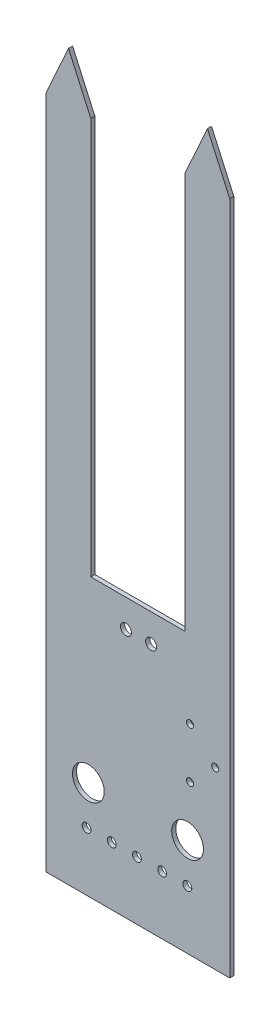
ISO-10303-21;
HEADER;
FILE_DESCRIPTION(('STEP AP214'),'2;1');
FILE_NAME('part.step','',(''),(''),'','','');
FILE_SCHEMA(('AUTOMOTIVE_DESIGN { 1 0 10303 214 1 1 1 1 }'));
ENDSEC;
DATA;
#1=APPLICATION_CONTEXT('core data for automotive mechanical design processes');
#2=APPLICATION_PROTOCOL_DEFINITION('international standard','automotive_design',2000,#1);
#3=PRODUCT_CONTEXT('',#1,'mechanical');
#4=PRODUCT('Part','Part','',(#3));
#5=PRODUCT_RELATED_PRODUCT_CATEGORY('part','',(#4));
#6=PRODUCT_DEFINITION_FORMATION('','',#4);
#7=PRODUCT_DEFINITION_CONTEXT('part definition',#1,'design');
#8=PRODUCT_DEFINITION('design','',#6,#7);
#9=PRODUCT_DEFINITION_SHAPE('','',#8);
#10=(LENGTH_UNIT() NAMED_UNIT(*) SI_UNIT(.MILLI.,.METRE.));
#11=(NAMED_UNIT(*) PLANE_ANGLE_UNIT() SI_UNIT($,.RADIAN.));
#12=(NAMED_UNIT(*) SI_UNIT($,.STERADIAN.) SOLID_ANGLE_UNIT());
#13=UNCERTAINTY_MEASURE_WITH_UNIT(LENGTH_MEASURE(1.E-05),#10,'distance_accuracy_value','');
#14=(GEOMETRIC_REPRESENTATION_CONTEXT(3) GLOBAL_UNCERTAINTY_ASSIGNED_CONTEXT((#13)) GLOBAL_UNIT_ASSIGNED_CONTEXT((#10,
#11,#12)) REPRESENTATION_CONTEXT('',''));
#15=CARTESIAN_POINT('',(0.,0.,0.));
#16=DIRECTION('',(0.,0.,1.));
#17=DIRECTION('',(1.,0.,0.));
#18=AXIS2_PLACEMENT_3D('',#15,#16,#17);
#19=CARTESIAN_POINT('',(149.56100463867,32.004001617432,0.41148));
#20=DIRECTION('',(0.,0.,1.));
#21=DIRECTION('',(1.,0.,0.));
#22=AXIS2_PLACEMENT_3D('',#19,#20,#21);
#23=PLANE('',#22);
#24=CARTESIAN_POINT('',(164.05999954,52.17999978,0.41148));
#25=DIRECTION('',(0.,0.,1.));
#26=DIRECTION('',(1.,0.,0.));
#27=AXIS2_PLACEMENT_3D('',#24,#25,#26);
#28=CIRCLE('',#27,0.35699954);
#29=CARTESIAN_POINT('',(164.41699908,52.17999978,0.41148));
#30=VERTEX_POINT('',#29);
#31=EDGE_CURVE('E27',#30,#30,#28,.T.);
#32=ORIENTED_EDGE('',*,*,#31,.F.);
#33=EDGE_LOOP('',(#32));
#34=FACE_BOUND('',#33,.T.);
#35=CARTESIAN_POINT('',(166.59999954,49.63999978,0.41148));
#36=DIRECTION('',(0.,0.,1.));
#37=DIRECTION('',(1.,0.,0.));
#38=AXIS2_PLACEMENT_3D('',#35,#36,#37);
#39=CIRCLE('',#38,0.35699954);
#40=CARTESIAN_POINT('',(166.95699908,49.63999978,0.41148));
#41=VERTEX_POINT('',#40);
#42=EDGE_CURVE('E232',#41,#41,#39,.T.);
#43=ORIENTED_EDGE('',*,*,#42,.F.);
#44=EDGE_LOOP('',(#43));
#45=FACE_BOUND('',#44,.T.);
#46=CARTESIAN_POINT('',(164.05999954,47.09999978,0.41148));
#47=DIRECTION('',(0.,0.,1.));
#48=DIRECTION('',(1.,0.,0.));
#49=AXIS2_PLACEMENT_3D('',#46,#47,#48);
#50=CIRCLE('',#49,0.35699954);
#51=CARTESIAN_POINT('',(164.41699908,47.09999978,0.41148));
#52=VERTEX_POINT('',#51);
#53=EDGE_CURVE('E20',#52,#52,#50,.T.);
#54=ORIENTED_EDGE('',*,*,#53,.F.);
#55=EDGE_LOOP('',(#54));
#56=FACE_BOUND('',#55,.T.);
#57=CARTESIAN_POINT('',(163.8110008,41.91860044,0.41148));
#58=DIRECTION('',(0.,0.,1.));
#59=DIRECTION('',(1.,0.,0.));
#60=AXIS2_PLACEMENT_3D('',#57,#58,#59);
#61=CIRCLE('',#60,1.59999934);
#62=CARTESIAN_POINT('',(165.41100014,41.91860044,0.41148));
#63=VERTEX_POINT('',#62);
#64=EDGE_CURVE('E389',#63,#63,#61,.T.);
#65=ORIENTED_EDGE('',*,*,#64,.F.);
#66=EDGE_LOOP('',(#65));
#67=FACE_BOUND('',#66,.T.);
#68=CARTESIAN_POINT('',(163.79000008,37.9000004,0.41148));
#69=DIRECTION('',(0.,0.,1.));
#70=DIRECTION('',(1.,0.,0.));
#71=AXIS2_PLACEMENT_3D('',#68,#69,#70);
#72=CIRCLE('',#71,0.4445);
#73=CARTESIAN_POINT('',(164.23450008,37.9000004,0.41148));
#74=VERTEX_POINT('',#73);
#75=EDGE_CURVE('E281',#74,#74,#72,.T.);
#76=ORIENTED_EDGE('',*,*,#75,.F.);
#77=EDGE_LOOP('',(#76));
#78=FACE_BOUND('',#77,.T.);
#79=CARTESIAN_POINT('',(161.25000008,37.9000004,0.41148));
#80=DIRECTION('',(0.,0.,1.));
#81=DIRECTION('',(1.,0.,0.));
#82=AXIS2_PLACEMENT_3D('',#79,#80,#81);
#83=CIRCLE('',#82,0.4445);
#84=CARTESIAN_POINT('',(161.69450008,37.9000004,0.41148));
#85=VERTEX_POINT('',#84);
#86=EDGE_CURVE('E383',#85,#85,#83,.T.);
#87=ORIENTED_EDGE('',*,*,#86,.F.);
#88=EDGE_LOOP('',(#87));
#89=FACE_BOUND('',#88,.T.);
#90=CARTESIAN_POINT('',(157.59999976,57.17999994,0.41148));
#91=DIRECTION('',(0.,0.,1.));
#92=DIRECTION('',(1.,0.,0.));
#93=AXIS2_PLACEMENT_3D('',#90,#91,#92);
#94=CIRCLE('',#93,0.5499989);
#95=CARTESIAN_POINT('',(158.14999866,57.17999994,0.41148));
#96=VERTEX_POINT('',#95);
#97=EDGE_CURVE('E294',#96,#96,#94,.T.);
#98=ORIENTED_EDGE('',*,*,#97,.F.);
#99=EDGE_LOOP('',(#98));
#100=FACE_BOUND('',#99,.T.);
#101=CARTESIAN_POINT('',(160.13999976,57.17999994,0.41148));
#102=DIRECTION('',(0.,0.,1.));
#103=DIRECTION('',(1.,0.,0.));
#104=AXIS2_PLACEMENT_3D('',#101,#102,#103);
#105=CIRCLE('',#104,0.5499989);
#106=CARTESIAN_POINT('',(160.68999866,57.17999994,0.41148));
#107=VERTEX_POINT('',#106);
#108=EDGE_CURVE('E267',#107,#107,#105,.T.);
#109=ORIENTED_EDGE('',*,*,#108,.F.);
#110=EDGE_LOOP('',(#109));
#111=FACE_BOUND('',#110,.T.);
#112=CARTESIAN_POINT('',(153.81100048,41.91860044,0.41148));
#113=DIRECTION('',(0.,0.,1.));
#114=DIRECTION('',(1.,0.,0.));
#115=AXIS2_PLACEMENT_3D('',#112,#113,#114);
#116=CIRCLE('',#115,1.59999934);
#117=CARTESIAN_POINT('',(155.41099982,41.91860044,0.41148));
#118=VERTEX_POINT('',#117);
#119=EDGE_CURVE('E290',#118,#118,#116,.T.);
#120=ORIENTED_EDGE('',*,*,#119,.F.);
#121=EDGE_LOOP('',(#120));
#122=FACE_BOUND('',#121,.T.);
#123=CARTESIAN_POINT('',(156.17000008,37.9000004,0.41148));
#124=DIRECTION('',(0.,0.,1.));
#125=DIRECTION('',(1.,0.,0.));
#126=AXIS2_PLACEMENT_3D('',#123,#124,#125);
#127=CIRCLE('',#126,0.4445);
#128=CARTESIAN_POINT('',(156.61450008,37.9000004,0.41148));
#129=VERTEX_POINT('',#128);
#130=EDGE_CURVE('E263',#129,#129,#127,.T.);
#131=ORIENTED_EDGE('',*,*,#130,.F.);
#132=EDGE_LOOP('',(#131));
#133=FACE_BOUND('',#132,.T.);
#134=CARTESIAN_POINT('',(158.71000008,37.9000004,0.41148));
#135=DIRECTION('',(0.,0.,1.));
#136=DIRECTION('',(1.,0.,0.));
#137=AXIS2_PLACEMENT_3D('',#134,#135,#136);
#138=CIRCLE('',#137,0.4445);
#139=CARTESIAN_POINT('',(159.15450008,37.9000004,0.41148));
#140=VERTEX_POINT('',#139);
#141=EDGE_CURVE('E256',#140,#140,#138,.T.);
#142=ORIENTED_EDGE('',*,*,#141,.F.);
#143=EDGE_LOOP('',(#142));
#144=FACE_BOUND('',#143,.T.);
#145=CARTESIAN_POINT('',(153.63000008,37.9000004,0.41148));
#146=DIRECTION('',(0.,0.,1.));
#147=DIRECTION('',(1.,0.,0.));
#148=AXIS2_PLACEMENT_3D('',#145,#146,#147);
#149=CIRCLE('',#148,0.4445);
#150=CARTESIAN_POINT('',(154.07450008,37.9000004,0.41148));
#151=VERTEX_POINT('',#150);
#152=EDGE_CURVE('E334',#151,#151,#149,.T.);
#153=ORIENTED_EDGE('',*,*,#152,.F.);
#154=EDGE_LOOP('',(#153));
#155=FACE_BOUND('',#154,.T.);
#156=DIRECTION('',(-1.,0.,0.));
#157=VECTOR('',#156,1.);
#158=CARTESIAN_POINT('',(168.06100463867,32.004001617432,0.41148));
#159=LINE('',#158,#157);
#160=CARTESIAN_POINT('',(168.06100463867,32.004001617432,0.41148));
#161=VERTEX_POINT('',#160);
#162=CARTESIAN_POINT('',(149.56100463867,32.004001617432,0.41148));
#163=VERTEX_POINT('',#162);
#164=EDGE_CURVE('E65',#161,#163,#159,.T.);
#165=ORIENTED_EDGE('',*,*,#164,.F.);
#166=DIRECTION('',(0.,-1.,0.));
#167=VECTOR('',#166,1.);
#168=CARTESIAN_POINT('',(168.06100463867,100.00399780273,0.41148));
#169=LINE('',#168,#167);
#170=CARTESIAN_POINT('',(168.06100463867,100.00399780273,0.41148));
#171=VERTEX_POINT('',#170);
#172=EDGE_CURVE('E356',#171,#161,#169,.T.);
#173=ORIENTED_EDGE('',*,*,#172,.F.);
#174=DIRECTION('',(0.410364677329006,-0.911921505175013,0.));
#175=VECTOR('',#174,1.);
#176=CARTESIAN_POINT('',(165.81100463867,105.00399780273,0.41148));
#177=LINE('',#176,#175);
#178=CARTESIAN_POINT('',(165.81100463867,105.00399780273,0.41148));
#179=VERTEX_POINT('',#178);
#180=EDGE_CURVE('E373',#179,#171,#177,.T.);
#181=ORIENTED_EDGE('',*,*,#180,.F.);
#182=DIRECTION('',(0.410364677329006,0.911921505175013,0.));
#183=VECTOR('',#182,1.);
#184=CARTESIAN_POINT('',(163.56100463867,100.00399780273,0.41148));
#185=LINE('',#184,#183);
#186=CARTESIAN_POINT('',(163.56100463867,100.00399780273,0.41148));
#187=VERTEX_POINT('',#186);
#188=EDGE_CURVE('E321',#187,#179,#185,.T.);
#189=ORIENTED_EDGE('',*,*,#188,.F.);
#190=DIRECTION('',(0.,1.,0.));
#191=VECTOR('',#190,1.);
#192=CARTESIAN_POINT('',(163.56100463867,60.004001617432,0.41148));
#193=LINE('',#192,#191);
#194=CARTESIAN_POINT('',(163.56100463867,60.004001617432,0.41148));
#195=VERTEX_POINT('',#194);
#196=EDGE_CURVE('E191',#195,#187,#193,.T.);
#197=ORIENTED_EDGE('',*,*,#196,.F.);
#198=DIRECTION('',(1.,0.,0.));
#199=VECTOR('',#198,1.);
#200=CARTESIAN_POINT('',(154.06100463867,60.004001617432,0.41148));
#201=LINE('',#200,#199);
#202=CARTESIAN_POINT('',(154.06100463867,60.004001617432,0.41148));
#203=VERTEX_POINT('',#202);
#204=EDGE_CURVE('E276',#203,#195,#201,.T.);
#205=ORIENTED_EDGE('',*,*,#204,.F.);
#206=DIRECTION('',(0.,-1.,0.));
#207=VECTOR('',#206,1.);
#208=CARTESIAN_POINT('',(154.06100463867,100.00399780273,0.41148));
#209=LINE('',#208,#207);
#210=CARTESIAN_POINT('',(154.06100463867,100.00399780273,0.41148));
#211=VERTEX_POINT('',#210);
#212=EDGE_CURVE('E257',#211,#203,#209,.T.);
#213=ORIENTED_EDGE('',*,*,#212,.F.);
#214=DIRECTION('',(0.410364677329006,-0.911921505175013,0.));
#215=VECTOR('',#214,1.);
#216=CARTESIAN_POINT('',(151.81100463867,105.00399780273,0.41148));
#217=LINE('',#216,#215);
#218=CARTESIAN_POINT('',(151.81100463867,105.00399780273,0.41148));
#219=VERTEX_POINT('',#218);
#220=EDGE_CURVE('E305',#219,#211,#217,.T.);
#221=ORIENTED_EDGE('',*,*,#220,.F.);
#222=DIRECTION('',(0.410364677329006,0.911921505175013,0.));
#223=VECTOR('',#222,1.);
#224=CARTESIAN_POINT('',(149.56100463867,100.00399780273,0.41148));
#225=LINE('',#224,#223);
#226=CARTESIAN_POINT('',(149.56100463867,100.00399780273,0.41148));
#227=VERTEX_POINT('',#226);
#228=EDGE_CURVE('E74',#227,#219,#225,.T.);
#229=ORIENTED_EDGE('',*,*,#228,.F.);
#230=DIRECTION('',(0.,1.,0.));
#231=VECTOR('',#230,1.);
#232=CARTESIAN_POINT('',(149.56100463867,32.004001617432,0.41148));
#233=LINE('',#232,#231);
#234=EDGE_CURVE('E300',#163,#227,#233,.T.);
#235=ORIENTED_EDGE('',*,*,#234,.F.);
#236=EDGE_LOOP('',(#165,#173,#181,#189,#197,#205,#213,#221,#229,#235));
#237=FACE_BOUND('',#236,.T.);
#238=ADVANCED_FACE('F16',(#34,#45,#56,#67,#78,#89,#100,#111,#122,#133,#144,#155,#237),#23,.T.);
#239=CARTESIAN_POINT('',(149.56100463867,32.004001617432,0.));
#240=DIRECTION('',(0.,0.,1.));
#241=DIRECTION('',(1.,0.,0.));
#242=AXIS2_PLACEMENT_3D('',#239,#240,#241);
#243=PLANE('',#242);
#244=CARTESIAN_POINT('',(164.05999954,52.17999978,0.));
#245=DIRECTION('',(0.,0.,1.));
#246=DIRECTION('',(1.,0.,0.));
#247=AXIS2_PLACEMENT_3D('',#244,#245,#246);
#248=CIRCLE('',#247,0.35699954);
#249=CARTESIAN_POINT('',(164.41699908,52.17999978,0.));
#250=VERTEX_POINT('',#249);
#251=EDGE_CURVE('E11',#250,#250,#248,.T.);
#252=ORIENTED_EDGE('',*,*,#251,.T.);
#253=EDGE_LOOP('',(#252));
#254=FACE_BOUND('',#253,.T.);
#255=CARTESIAN_POINT('',(166.59999954,49.63999978,0.));
#256=DIRECTION('',(0.,0.,1.));
#257=DIRECTION('',(1.,0.,0.));
#258=AXIS2_PLACEMENT_3D('',#255,#256,#257);
#259=CIRCLE('',#258,0.35699954);
#260=CARTESIAN_POINT('',(166.95699908,49.63999978,0.));
#261=VERTEX_POINT('',#260);
#262=EDGE_CURVE('E238',#261,#261,#259,.T.);
#263=ORIENTED_EDGE('',*,*,#262,.T.);
#264=EDGE_LOOP('',(#263));
#265=FACE_BOUND('',#264,.T.);
#266=CARTESIAN_POINT('',(164.05999954,47.09999978,0.));
#267=DIRECTION('',(0.,0.,1.));
#268=DIRECTION('',(1.,0.,0.));
#269=AXIS2_PLACEMENT_3D('',#266,#267,#268);
#270=CIRCLE('',#269,0.35699954);
#271=CARTESIAN_POINT('',(164.41699908,47.09999978,0.));
#272=VERTEX_POINT('',#271);
#273=EDGE_CURVE('E247',#272,#272,#270,.T.);
#274=ORIENTED_EDGE('',*,*,#273,.T.);
#275=EDGE_LOOP('',(#274));
#276=FACE_BOUND('',#275,.T.);
#277=CARTESIAN_POINT('',(163.8110008,41.91860044,0.));
#278=DIRECTION('',(0.,0.,1.));
#279=DIRECTION('',(1.,0.,0.));
#280=AXIS2_PLACEMENT_3D('',#277,#278,#279);
#281=CIRCLE('',#280,1.59999934);
#282=CARTESIAN_POINT('',(165.41100014,41.91860044,0.));
#283=VERTEX_POINT('',#282);
#284=EDGE_CURVE('E391',#283,#283,#281,.T.);
#285=ORIENTED_EDGE('',*,*,#284,.T.);
#286=EDGE_LOOP('',(#285));
#287=FACE_BOUND('',#286,.T.);
#288=CARTESIAN_POINT('',(163.79000008,37.9000004,0.));
#289=DIRECTION('',(0.,0.,1.));
#290=DIRECTION('',(1.,0.,0.));
#291=AXIS2_PLACEMENT_3D('',#288,#289,#290);
#292=CIRCLE('',#291,0.4445);
#293=CARTESIAN_POINT('',(164.23450008,37.9000004,0.));
#294=VERTEX_POINT('',#293);
#295=EDGE_CURVE('E456',#294,#294,#292,.T.);
#296=ORIENTED_EDGE('',*,*,#295,.T.);
#297=EDGE_LOOP('',(#296));
#298=FACE_BOUND('',#297,.T.);
#299=CARTESIAN_POINT('',(161.25000008,37.9000004,0.));
#300=DIRECTION('',(0.,0.,1.));
#301=DIRECTION('',(1.,0.,0.));
#302=AXIS2_PLACEMENT_3D('',#299,#300,#301);
#303=CIRCLE('',#302,0.4445);
#304=CARTESIAN_POINT('',(161.69450008,37.9000004,0.));
#305=VERTEX_POINT('',#304);
#306=EDGE_CURVE('E282',#305,#305,#303,.T.);
#307=ORIENTED_EDGE('',*,*,#306,.T.);
#308=EDGE_LOOP('',(#307));
#309=FACE_BOUND('',#308,.T.);
#310=CARTESIAN_POINT('',(157.59999976,57.17999994,0.));
#311=DIRECTION('',(0.,0.,1.));
#312=DIRECTION('',(1.,0.,0.));
#313=AXIS2_PLACEMENT_3D('',#310,#311,#312);
#314=CIRCLE('',#313,0.5499989);
#315=CARTESIAN_POINT('',(158.14999866,57.17999994,0.));
#316=VERTEX_POINT('',#315);
#317=EDGE_CURVE('E291',#316,#316,#314,.T.);
#318=ORIENTED_EDGE('',*,*,#317,.T.);
#319=EDGE_LOOP('',(#318));
#320=FACE_BOUND('',#319,.T.);
#321=CARTESIAN_POINT('',(160.13999976,57.17999994,0.));
#322=DIRECTION('',(0.,0.,1.));
#323=DIRECTION('',(1.,0.,0.));
#324=AXIS2_PLACEMENT_3D('',#321,#322,#323);
#325=CIRCLE('',#324,0.5499989);
#326=CARTESIAN_POINT('',(160.68999866,57.17999994,0.));
#327=VERTEX_POINT('',#326);
#328=EDGE_CURVE('E270',#327,#327,#325,.T.);
#329=ORIENTED_EDGE('',*,*,#328,.T.);
#330=EDGE_LOOP('',(#329));
#331=FACE_BOUND('',#330,.T.);
#332=CARTESIAN_POINT('',(153.81100048,41.91860044,0.));
#333=DIRECTION('',(0.,0.,1.));
#334=DIRECTION('',(1.,0.,0.));
#335=AXIS2_PLACEMENT_3D('',#332,#333,#334);
#336=CIRCLE('',#335,1.59999934);
#337=CARTESIAN_POINT('',(155.41099982,41.91860044,0.));
#338=VERTEX_POINT('',#337);
#339=EDGE_CURVE('E287',#338,#338,#336,.T.);
#340=ORIENTED_EDGE('',*,*,#339,.T.);
#341=EDGE_LOOP('',(#340));
#342=FACE_BOUND('',#341,.T.);
#343=CARTESIAN_POINT('',(156.17000008,37.9000004,0.));
#344=DIRECTION('',(0.,0.,1.));
#345=DIRECTION('',(1.,0.,0.));
#346=AXIS2_PLACEMENT_3D('',#343,#344,#345);
#347=CIRCLE('',#346,0.4445);
#348=CARTESIAN_POINT('',(156.61450008,37.9000004,0.));
#349=VERTEX_POINT('',#348);
#350=EDGE_CURVE('E266',#349,#349,#347,.T.);
#351=ORIENTED_EDGE('',*,*,#350,.T.);
#352=EDGE_LOOP('',(#351));
#353=FACE_BOUND('',#352,.T.);
#354=CARTESIAN_POINT('',(158.71000008,37.9000004,0.));
#355=DIRECTION('',(0.,0.,1.));
#356=DIRECTION('',(1.,0.,0.));
#357=AXIS2_PLACEMENT_3D('',#354,#355,#356);
#358=CIRCLE('',#357,0.4445);
#359=CARTESIAN_POINT('',(159.15450008,37.9000004,0.));
#360=VERTEX_POINT('',#359);
#361=EDGE_CURVE('E252',#360,#360,#358,.T.);
#362=ORIENTED_EDGE('',*,*,#361,.T.);
#363=EDGE_LOOP('',(#362));
#364=FACE_BOUND('',#363,.T.);
#365=CARTESIAN_POINT('',(153.63000008,37.9000004,0.));
#366=DIRECTION('',(0.,0.,1.));
#367=DIRECTION('',(1.,0.,0.));
#368=AXIS2_PLACEMENT_3D('',#365,#366,#367);
#369=CIRCLE('',#368,0.4445);
#370=CARTESIAN_POINT('',(154.07450008,37.9000004,0.));
#371=VERTEX_POINT('',#370);
#372=EDGE_CURVE('E330',#371,#371,#369,.T.);
#373=ORIENTED_EDGE('',*,*,#372,.T.);
#374=EDGE_LOOP('',(#373));
#375=FACE_BOUND('',#374,.T.);
#376=DIRECTION('',(0.,1.,0.));
#377=VECTOR('',#376,1.);
#378=CARTESIAN_POINT('',(149.56100463867,32.004001617432,0.));
#379=LINE('',#378,#377);
#380=CARTESIAN_POINT('',(149.56100463867,32.004001617432,0.));
#381=VERTEX_POINT('',#380);
#382=CARTESIAN_POINT('',(149.56100463867,100.00399780273,0.));
#383=VERTEX_POINT('',#382);
#384=EDGE_CURVE('E299',#381,#383,#379,.T.);
#385=ORIENTED_EDGE('',*,*,#384,.T.);
#386=DIRECTION('',(0.410364677329006,0.911921505175013,0.));
#387=VECTOR('',#386,1.);
#388=CARTESIAN_POINT('',(149.56100463867,100.00399780273,0.));
#389=LINE('',#388,#387);
#390=CARTESIAN_POINT('',(151.81100463867,105.00399780273,0.));
#391=VERTEX_POINT('',#390);
#392=EDGE_CURVE('E86',#383,#391,#389,.T.);
#393=ORIENTED_EDGE('',*,*,#392,.T.);
#394=DIRECTION('',(0.410364677329006,-0.911921505175013,0.));
#395=VECTOR('',#394,1.);
#396=CARTESIAN_POINT('',(151.81100463867,105.00399780273,0.));
#397=LINE('',#396,#395);
#398=CARTESIAN_POINT('',(154.06100463867,100.00399780273,0.));
#399=VERTEX_POINT('',#398);
#400=EDGE_CURVE('E262',#391,#399,#397,.T.);
#401=ORIENTED_EDGE('',*,*,#400,.T.);
#402=DIRECTION('',(0.,-1.,0.));
#403=VECTOR('',#402,1.);
#404=CARTESIAN_POINT('',(154.06100463867,100.00399780273,0.));
#405=LINE('',#404,#403);
#406=CARTESIAN_POINT('',(154.06100463867,60.004001617432,0.));
#407=VERTEX_POINT('',#406);
#408=EDGE_CURVE('E272',#399,#407,#405,.T.);
#409=ORIENTED_EDGE('',*,*,#408,.T.);
#410=DIRECTION('',(1.,0.,0.));
#411=VECTOR('',#410,1.);
#412=CARTESIAN_POINT('',(154.06100463867,60.004001617432,0.));
#413=LINE('',#412,#411);
#414=CARTESIAN_POINT('',(163.56100463867,60.004001617432,0.));
#415=VERTEX_POINT('',#414);
#416=EDGE_CURVE('E286',#407,#415,#413,.T.);
#417=ORIENTED_EDGE('',*,*,#416,.T.);
#418=DIRECTION('',(0.,1.,0.));
#419=VECTOR('',#418,1.);
#420=CARTESIAN_POINT('',(163.56100463867,60.004001617432,0.));
#421=LINE('',#420,#419);
#422=CARTESIAN_POINT('',(163.56100463867,100.00399780273,0.));
#423=VERTEX_POINT('',#422);
#424=EDGE_CURVE('E201',#415,#423,#421,.T.);
#425=ORIENTED_EDGE('',*,*,#424,.T.);
#426=DIRECTION('',(0.410364677329006,0.911921505175013,0.));
#427=VECTOR('',#426,1.);
#428=CARTESIAN_POINT('',(163.56100463867,100.00399780273,0.));
#429=LINE('',#428,#427);
#430=CARTESIAN_POINT('',(165.81100463867,105.00399780273,0.));
#431=VERTEX_POINT('',#430);
#432=EDGE_CURVE('E320',#423,#431,#429,.T.);
#433=ORIENTED_EDGE('',*,*,#432,.T.);
#434=DIRECTION('',(0.410364677329006,-0.911921505175013,0.));
#435=VECTOR('',#434,1.);
#436=CARTESIAN_POINT('',(165.81100463867,105.00399780273,0.));
#437=LINE('',#436,#435);
#438=CARTESIAN_POINT('',(168.06100463867,100.00399780273,0.));
#439=VERTEX_POINT('',#438);
#440=EDGE_CURVE('E447',#431,#439,#437,.T.);
#441=ORIENTED_EDGE('',*,*,#440,.T.);
#442=DIRECTION('',(0.,-1.,0.));
#443=VECTOR('',#442,1.);
#444=CARTESIAN_POINT('',(168.06100463867,100.00399780273,0.));
#445=LINE('',#444,#443);
#446=CARTESIAN_POINT('',(168.06100463867,32.004001617432,0.));
#447=VERTEX_POINT('',#446);
#448=EDGE_CURVE('E306',#439,#447,#445,.T.);
#449=ORIENTED_EDGE('',*,*,#448,.T.);
#450=DIRECTION('',(-1.,0.,0.));
#451=VECTOR('',#450,1.);
#452=CARTESIAN_POINT('',(168.06100463867,32.004001617432,0.));
#453=LINE('',#452,#451);
#454=EDGE_CURVE('E439',#447,#381,#453,.T.);
#455=ORIENTED_EDGE('',*,*,#454,.T.);
#456=EDGE_LOOP('',(#385,#393,#401,#409,#417,#425,#433,#441,#449,#455));
#457=FACE_BOUND('',#456,.T.);
#458=ADVANCED_FACE('F409',(#254,#265,#276,#287,#298,#309,#320,#331,#342,#353,#364,#375,#457),
#243,.F.);
#459=CARTESIAN_POINT('',(164.05999954,52.17999978,0.));
#460=DIRECTION('',(0.,0.,-1.));
#461=DIRECTION('',(1.,0.,0.));
#462=AXIS2_PLACEMENT_3D('',#459,#460,#461);
#463=CYLINDRICAL_SURFACE('',#462,0.35699954);
#464=DIRECTION('',(0.,0.,1.));
#465=VECTOR('',#464,1.);
#466=CARTESIAN_POINT('',(164.41699908,52.17999978,0.));
#467=LINE('',#466,#465);
#468=EDGE_CURVE('E245',#250,#30,#467,.T.);
#469=ORIENTED_EDGE('',*,*,#468,.T.);
#470=ORIENTED_EDGE('',*,*,#31,.T.);
#471=ORIENTED_EDGE('',*,*,#468,.F.);
#472=ORIENTED_EDGE('',*,*,#251,.F.);
#473=EDGE_LOOP('',(#469,#470,#471,#472));
#474=FACE_BOUND('',#473,.T.);
#475=ADVANCED_FACE('F500',(#474),#463,.F.);
#476=CARTESIAN_POINT('',(166.59999954,49.63999978,0.));
#477=DIRECTION('',(0.,0.,-1.));
#478=DIRECTION('',(1.,0.,0.));
#479=AXIS2_PLACEMENT_3D('',#476,#477,#478);
#480=CYLINDRICAL_SURFACE('',#479,0.35699954);
#481=DIRECTION('',(0.,0.,1.));
#482=VECTOR('',#481,1.);
#483=CARTESIAN_POINT('',(166.95699908,49.63999978,0.));
#484=LINE('',#483,#482);
#485=EDGE_CURVE('E235',#261,#41,#484,.T.);
#486=ORIENTED_EDGE('',*,*,#485,.T.);
#487=ORIENTED_EDGE('',*,*,#42,.T.);
#488=ORIENTED_EDGE('',*,*,#485,.F.);
#489=ORIENTED_EDGE('',*,*,#262,.F.);
#490=EDGE_LOOP('',(#486,#487,#488,#489));
#491=FACE_BOUND('',#490,.T.);
#492=ADVANCED_FACE('F233',(#491),#480,.F.);
#493=CARTESIAN_POINT('',(164.05999954,47.09999978,0.));
#494=DIRECTION('',(0.,0.,-1.));
#495=DIRECTION('',(1.,0.,0.));
#496=AXIS2_PLACEMENT_3D('',#493,#494,#495);
#497=CYLINDRICAL_SURFACE('',#496,0.35699954);
#498=DIRECTION('',(0.,0.,1.));
#499=VECTOR('',#498,1.);
#500=CARTESIAN_POINT('',(164.41699908,47.09999978,0.));
#501=LINE('',#500,#499);
#502=EDGE_CURVE('E450',#272,#52,#501,.T.);
#503=ORIENTED_EDGE('',*,*,#502,.T.);
#504=ORIENTED_EDGE('',*,*,#53,.T.);
#505=ORIENTED_EDGE('',*,*,#502,.F.);
#506=ORIENTED_EDGE('',*,*,#273,.F.);
#507=EDGE_LOOP('',(#503,#504,#505,#506));
#508=FACE_BOUND('',#507,.T.);
#509=ADVANCED_FACE('F535',(#508),#497,.F.);
#510=CARTESIAN_POINT('',(163.8110008,41.91860044,0.));
#511=DIRECTION('',(0.,0.,-1.));
#512=DIRECTION('',(1.,0.,0.));
#513=AXIS2_PLACEMENT_3D('',#510,#511,#512);
#514=CYLINDRICAL_SURFACE('',#513,1.59999934);
#515=DIRECTION('',(0.,0.,1.));
#516=VECTOR('',#515,1.);
#517=CARTESIAN_POINT('',(165.41100014,41.91860044,0.));
#518=LINE('',#517,#516);
#519=EDGE_CURVE('E392',#283,#63,#518,.T.);
#520=ORIENTED_EDGE('',*,*,#519,.T.);
#521=ORIENTED_EDGE('',*,*,#64,.T.);
#522=ORIENTED_EDGE('',*,*,#519,.F.);
#523=ORIENTED_EDGE('',*,*,#284,.F.);
#524=EDGE_LOOP('',(#520,#521,#522,#523));
#525=FACE_BOUND('',#524,.T.);
#526=ADVANCED_FACE('F538',(#525),#514,.F.);
#527=CARTESIAN_POINT('',(163.79000008,37.9000004,0.));
#528=DIRECTION('',(0.,0.,-1.));
#529=DIRECTION('',(1.,0.,0.));
#530=AXIS2_PLACEMENT_3D('',#527,#528,#529);
#531=CYLINDRICAL_SURFACE('',#530,0.4445);
#532=DIRECTION('',(0.,0.,1.));
#533=VECTOR('',#532,1.);
#534=CARTESIAN_POINT('',(164.23450008,37.9000004,0.));
#535=LINE('',#534,#533);
#536=EDGE_CURVE('E277',#294,#74,#535,.T.);
#537=ORIENTED_EDGE('',*,*,#536,.T.);
#538=ORIENTED_EDGE('',*,*,#75,.T.);
#539=ORIENTED_EDGE('',*,*,#536,.F.);
#540=ORIENTED_EDGE('',*,*,#295,.F.);
#541=EDGE_LOOP('',(#537,#538,#539,#540));
#542=FACE_BOUND('',#541,.T.);
#543=ADVANCED_FACE('F473',(#542),#531,.F.);
#544=CARTESIAN_POINT('',(161.25000008,37.9000004,0.));
#545=DIRECTION('',(0.,0.,-1.));
#546=DIRECTION('',(1.,0.,0.));
#547=AXIS2_PLACEMENT_3D('',#544,#545,#546);
#548=CYLINDRICAL_SURFACE('',#547,0.4445);
#549=DIRECTION('',(0.,0.,1.));
#550=VECTOR('',#549,1.);
#551=CARTESIAN_POINT('',(161.69450008,37.9000004,0.));
#552=LINE('',#551,#550);
#553=EDGE_CURVE('E293',#305,#85,#552,.T.);
#554=ORIENTED_EDGE('',*,*,#553,.T.);
#555=ORIENTED_EDGE('',*,*,#86,.T.);
#556=ORIENTED_EDGE('',*,*,#553,.F.);
#557=ORIENTED_EDGE('',*,*,#306,.F.);
#558=EDGE_LOOP('',(#554,#555,#556,#557));
#559=FACE_BOUND('',#558,.T.);
#560=ADVANCED_FACE('F554',(#559),#548,.F.);
#561=CARTESIAN_POINT('',(157.59999976,57.17999994,0.));
#562=DIRECTION('',(0.,0.,-1.));
#563=DIRECTION('',(1.,0.,0.));
#564=AXIS2_PLACEMENT_3D('',#561,#562,#563);
#565=CYLINDRICAL_SURFACE('',#564,0.5499989);
#566=DIRECTION('',(0.,0.,1.));
#567=VECTOR('',#566,1.);
#568=CARTESIAN_POINT('',(158.14999866,57.17999994,0.));
#569=LINE('',#568,#567);
#570=EDGE_CURVE('E329',#316,#96,#569,.T.);
#571=ORIENTED_EDGE('',*,*,#570,.T.);
#572=ORIENTED_EDGE('',*,*,#97,.T.);
#573=ORIENTED_EDGE('',*,*,#570,.F.);
#574=ORIENTED_EDGE('',*,*,#317,.F.);
#575=EDGE_LOOP('',(#571,#572,#573,#574));
#576=FACE_BOUND('',#575,.T.);
#577=ADVANCED_FACE('F513',(#576),#565,.F.);
#578=CARTESIAN_POINT('',(160.13999976,57.17999994,0.));
#579=DIRECTION('',(0.,0.,-1.));
#580=DIRECTION('',(1.,0.,0.));
#581=AXIS2_PLACEMENT_3D('',#578,#579,#580);
#582=CYLINDRICAL_SURFACE('',#581,0.5499989);
#583=DIRECTION('',(0.,0.,1.));
#584=VECTOR('',#583,1.);
#585=CARTESIAN_POINT('',(160.68999866,57.17999994,0.));
#586=LINE('',#585,#584);
#587=EDGE_CURVE('E271',#327,#107,#586,.T.);
#588=ORIENTED_EDGE('',*,*,#587,.T.);
#589=ORIENTED_EDGE('',*,*,#108,.T.);
#590=ORIENTED_EDGE('',*,*,#587,.F.);
#591=ORIENTED_EDGE('',*,*,#328,.F.);
#592=EDGE_LOOP('',(#588,#589,#590,#591));
#593=FACE_BOUND('',#592,.T.);
#594=ADVANCED_FACE('F510',(#593),#582,.F.);
#595=CARTESIAN_POINT('',(153.81100048,41.91860044,0.));
#596=DIRECTION('',(0.,0.,-1.));
#597=DIRECTION('',(1.,0.,0.));
#598=AXIS2_PLACEMENT_3D('',#595,#596,#597);
#599=CYLINDRICAL_SURFACE('',#598,1.59999934);
#600=DIRECTION('',(0.,0.,1.));
#601=VECTOR('',#600,1.);
#602=CARTESIAN_POINT('',(155.41099982,41.91860044,0.));
#603=LINE('',#602,#601);
#604=EDGE_CURVE('E326',#338,#118,#603,.T.);
#605=ORIENTED_EDGE('',*,*,#604,.T.);
#606=ORIENTED_EDGE('',*,*,#119,.T.);
#607=ORIENTED_EDGE('',*,*,#604,.F.);
#608=ORIENTED_EDGE('',*,*,#339,.F.);
#609=EDGE_LOOP('',(#605,#606,#607,#608));
#610=FACE_BOUND('',#609,.T.);
#611=ADVANCED_FACE('F18',(#610),#599,.F.);
#612=CARTESIAN_POINT('',(156.17000008,37.9000004,0.));
#613=DIRECTION('',(0.,0.,-1.));
#614=DIRECTION('',(1.,0.,0.));
#615=AXIS2_PLACEMENT_3D('',#612,#613,#614);
#616=CYLINDRICAL_SURFACE('',#615,0.4445);
#617=DIRECTION('',(0.,0.,1.));
#618=VECTOR('',#617,1.);
#619=CARTESIAN_POINT('',(156.61450008,37.9000004,0.));
#620=LINE('',#619,#618);
#621=EDGE_CURVE('E255',#349,#129,#620,.T.);
#622=ORIENTED_EDGE('',*,*,#621,.T.);
#623=ORIENTED_EDGE('',*,*,#130,.T.);
#624=ORIENTED_EDGE('',*,*,#621,.F.);
#625=ORIENTED_EDGE('',*,*,#350,.F.);
#626=EDGE_LOOP('',(#622,#623,#624,#625));
#627=FACE_BOUND('',#626,.T.);
#628=ADVANCED_FACE('F532',(#627),#616,.F.);
#629=CARTESIAN_POINT('',(158.71000008,37.9000004,0.));
#630=DIRECTION('',(0.,0.,-1.));
#631=DIRECTION('',(1.,0.,0.));
#632=AXIS2_PLACEMENT_3D('',#629,#630,#631);
#633=CYLINDRICAL_SURFACE('',#632,0.4445);
#634=DIRECTION('',(0.,0.,1.));
#635=VECTOR('',#634,1.);
#636=CARTESIAN_POINT('',(159.15450008,37.9000004,0.));
#637=LINE('',#636,#635);
#638=EDGE_CURVE('E333',#360,#140,#637,.T.);
#639=ORIENTED_EDGE('',*,*,#638,.T.);
#640=ORIENTED_EDGE('',*,*,#141,.T.);
#641=ORIENTED_EDGE('',*,*,#638,.F.);
#642=ORIENTED_EDGE('',*,*,#361,.F.);
#643=EDGE_LOOP('',(#639,#640,#641,#642));
#644=FACE_BOUND('',#643,.T.);
#645=ADVANCED_FACE('F530',(#644),#633,.F.);
#646=CARTESIAN_POINT('',(153.63000008,37.9000004,0.));
#647=DIRECTION('',(0.,0.,-1.));
#648=DIRECTION('',(1.,0.,0.));
#649=AXIS2_PLACEMENT_3D('',#646,#647,#648);
#650=CYLINDRICAL_SURFACE('',#649,0.4445);
#651=DIRECTION('',(0.,0.,1.));
#652=VECTOR('',#651,1.);
#653=CARTESIAN_POINT('',(154.07450008,37.9000004,0.));
#654=LINE('',#653,#652);
#655=EDGE_CURVE('E363',#371,#151,#654,.T.);
#656=ORIENTED_EDGE('',*,*,#655,.T.);
#657=ORIENTED_EDGE('',*,*,#152,.T.);
#658=ORIENTED_EDGE('',*,*,#655,.F.);
#659=ORIENTED_EDGE('',*,*,#372,.F.);
#660=EDGE_LOOP('',(#656,#657,#658,#659));
#661=FACE_BOUND('',#660,.T.);
#662=ADVANCED_FACE('F497',(#661),#650,.F.);
#663=CARTESIAN_POINT('',(168.06100463867,32.004001617432,0.));
#664=DIRECTION('',(0.,-1.,0.));
#665=DIRECTION('',(0.,0.,-1.));
#666=AXIS2_PLACEMENT_3D('',#663,#664,#665);
#667=PLANE('',#666);
#668=DIRECTION('',(0.,0.,1.));
#669=VECTOR('',#668,1.);
#670=CARTESIAN_POINT('',(168.06100463867,32.004001617432,0.));
#671=LINE('',#670,#669);
#672=EDGE_CURVE('E310',#447,#161,#671,.T.);
#673=ORIENTED_EDGE('',*,*,#672,.T.);
#674=ORIENTED_EDGE('',*,*,#164,.T.);
#675=DIRECTION('',(0.,0.,1.));
#676=VECTOR('',#675,1.);
#677=CARTESIAN_POINT('',(149.56100463867,32.004001617432,0.));
#678=LINE('',#677,#676);
#679=EDGE_CURVE('E440',#381,#163,#678,.T.);
#680=ORIENTED_EDGE('',*,*,#679,.F.);
#681=ORIENTED_EDGE('',*,*,#454,.F.);
#682=EDGE_LOOP('',(#673,#674,#680,#681));
#683=FACE_BOUND('',#682,.T.);
#684=ADVANCED_FACE('F529',(#683),#667,.T.);
#685=CARTESIAN_POINT('',(168.06100463867,100.00399780273,0.));
#686=DIRECTION('',(1.,0.,0.));
#687=DIRECTION('',(0.,1.,0.));
#688=AXIS2_PLACEMENT_3D('',#685,#686,#687);
#689=PLANE('',#688);
#690=DIRECTION('',(0.,0.,1.));
#691=VECTOR('',#690,1.);
#692=CARTESIAN_POINT('',(168.06100463867,100.00399780273,0.));
#693=LINE('',#692,#691);
#694=EDGE_CURVE('E377',#439,#171,#693,.T.);
#695=ORIENTED_EDGE('',*,*,#694,.T.);
#696=ORIENTED_EDGE('',*,*,#172,.T.);
#697=ORIENTED_EDGE('',*,*,#672,.F.);
#698=ORIENTED_EDGE('',*,*,#448,.F.);
#699=EDGE_LOOP('',(#695,#696,#697,#698));
#700=FACE_BOUND('',#699,.T.);
#701=ADVANCED_FACE('F542',(#700),#689,.T.);
#702=CARTESIAN_POINT('',(165.81100463867,105.00399780273,0.));
#703=DIRECTION('',(0.911921505175013,0.410364677329006,0.));
#704=DIRECTION('',(0.,0.,-1.));
#705=AXIS2_PLACEMENT_3D('',#702,#703,#704);
#706=PLANE('',#705);
#707=DIRECTION('',(0.,0.,1.));
#708=VECTOR('',#707,1.);
#709=CARTESIAN_POINT('',(165.81100463867,105.00399780273,0.));
#710=LINE('',#709,#708);
#711=EDGE_CURVE('E316',#431,#179,#710,.T.);
#712=ORIENTED_EDGE('',*,*,#711,.T.);
#713=ORIENTED_EDGE('',*,*,#180,.T.);
#714=ORIENTED_EDGE('',*,*,#694,.F.);
#715=ORIENTED_EDGE('',*,*,#440,.F.);
#716=EDGE_LOOP('',(#712,#713,#714,#715));
#717=FACE_BOUND('',#716,.T.);
#718=ADVANCED_FACE('F519',(#717),#706,.T.);
#719=CARTESIAN_POINT('',(163.56100463867,100.00399780273,0.));
#720=DIRECTION('',(-0.911921505175013,0.410364677329006,0.));
#721=DIRECTION('',(0.,0.,1.));
#722=AXIS2_PLACEMENT_3D('',#719,#720,#721);
#723=PLANE('',#722);
#724=DIRECTION('',(0.,0.,1.));
#725=VECTOR('',#724,1.);
#726=CARTESIAN_POINT('',(163.56100463867,100.00399780273,0.));
#727=LINE('',#726,#725);
#728=EDGE_CURVE('E285',#423,#187,#727,.T.);
#729=ORIENTED_EDGE('',*,*,#728,.T.);
#730=ORIENTED_EDGE('',*,*,#188,.T.);
#731=ORIENTED_EDGE('',*,*,#711,.F.);
#732=ORIENTED_EDGE('',*,*,#432,.F.);
#733=EDGE_LOOP('',(#729,#730,#731,#732));
#734=FACE_BOUND('',#733,.T.);
#735=ADVANCED_FACE('F515',(#734),#723,.T.);
#736=CARTESIAN_POINT('',(163.56100463867,60.004001617432,0.));
#737=DIRECTION('',(-1.,0.,0.));
#738=DIRECTION('',(0.,0.,1.));
#739=AXIS2_PLACEMENT_3D('',#736,#737,#738);
#740=PLANE('',#739);
#741=DIRECTION('',(0.,0.,1.));
#742=VECTOR('',#741,1.);
#743=CARTESIAN_POINT('',(163.56100463867,60.004001617432,0.));
#744=LINE('',#743,#742);
#745=EDGE_CURVE('E335',#415,#195,#744,.T.);
#746=ORIENTED_EDGE('',*,*,#745,.T.);
#747=ORIENTED_EDGE('',*,*,#196,.T.);
#748=ORIENTED_EDGE('',*,*,#728,.F.);
#749=ORIENTED_EDGE('',*,*,#424,.F.);
#750=EDGE_LOOP('',(#746,#747,#748,#749));
#751=FACE_BOUND('',#750,.T.);
#752=ADVANCED_FACE('F518',(#751),#740,.T.);
#753=CARTESIAN_POINT('',(154.06100463867,60.004001617432,0.));
#754=DIRECTION('',(0.,1.,0.));
#755=DIRECTION('',(1.,0.,0.));
#756=AXIS2_PLACEMENT_3D('',#753,#754,#755);
#757=PLANE('',#756);
#758=DIRECTION('',(0.,0.,1.));
#759=VECTOR('',#758,1.);
#760=CARTESIAN_POINT('',(154.06100463867,60.004001617432,0.));
#761=LINE('',#760,#759);
#762=EDGE_CURVE('E261',#407,#203,#761,.T.);
#763=ORIENTED_EDGE('',*,*,#762,.T.);
#764=ORIENTED_EDGE('',*,*,#204,.T.);
#765=ORIENTED_EDGE('',*,*,#745,.F.);
#766=ORIENTED_EDGE('',*,*,#416,.F.);
#767=EDGE_LOOP('',(#763,#764,#765,#766));
#768=FACE_BOUND('',#767,.T.);
#769=ADVANCED_FACE('F426',(#768),#757,.T.);
#770=CARTESIAN_POINT('',(154.06100463867,100.00399780273,0.));
#771=DIRECTION('',(1.,0.,0.));
#772=DIRECTION('',(0.,1.,0.));
#773=AXIS2_PLACEMENT_3D('',#770,#771,#772);
#774=PLANE('',#773);
#775=DIRECTION('',(0.,0.,1.));
#776=VECTOR('',#775,1.);
#777=CARTESIAN_POINT('',(154.06100463867,100.00399780273,0.));
#778=LINE('',#777,#776);
#779=EDGE_CURVE('E301',#399,#211,#778,.T.);
#780=ORIENTED_EDGE('',*,*,#779,.T.);
#781=ORIENTED_EDGE('',*,*,#212,.T.);
#782=ORIENTED_EDGE('',*,*,#762,.F.);
#783=ORIENTED_EDGE('',*,*,#408,.F.);
#784=EDGE_LOOP('',(#780,#781,#782,#783));
#785=FACE_BOUND('',#784,.T.);
#786=ADVANCED_FACE('F406',(#785),#774,.T.);
#787=CARTESIAN_POINT('',(151.81100463867,105.00399780273,0.));
#788=DIRECTION('',(0.911921505175013,0.410364677329006,0.));
#789=DIRECTION('',(0.,0.,-1.));
#790=AXIS2_PLACEMENT_3D('',#787,#788,#789);
#791=PLANE('',#790);
#792=DIRECTION('',(0.,0.,1.));
#793=VECTOR('',#792,1.);
#794=CARTESIAN_POINT('',(151.81100463867,105.00399780273,0.));
#795=LINE('',#794,#793);
#796=EDGE_CURVE('E313',#391,#219,#795,.T.);
#797=ORIENTED_EDGE('',*,*,#796,.T.);
#798=ORIENTED_EDGE('',*,*,#220,.T.);
#799=ORIENTED_EDGE('',*,*,#779,.F.);
#800=ORIENTED_EDGE('',*,*,#400,.F.);
#801=EDGE_LOOP('',(#797,#798,#799,#800));
#802=FACE_BOUND('',#801,.T.);
#803=ADVANCED_FACE('F400',(#802),#791,.T.);
#804=CARTESIAN_POINT('',(149.56100463867,100.00399780273,0.));
#805=DIRECTION('',(-0.911921505175013,0.410364677329006,0.));
#806=DIRECTION('',(0.,0.,1.));
#807=AXIS2_PLACEMENT_3D('',#804,#805,#806);
#808=PLANE('',#807);
#809=DIRECTION('',(0.,0.,1.));
#810=VECTOR('',#809,1.);
#811=CARTESIAN_POINT('',(149.56100463867,100.00399780273,0.));
#812=LINE('',#811,#810);
#813=EDGE_CURVE('E296',#383,#227,#812,.T.);
#814=ORIENTED_EDGE('',*,*,#813,.T.);
#815=ORIENTED_EDGE('',*,*,#228,.T.);
#816=ORIENTED_EDGE('',*,*,#796,.F.);
#817=ORIENTED_EDGE('',*,*,#392,.F.);
#818=EDGE_LOOP('',(#814,#815,#816,#817));
#819=FACE_BOUND('',#818,.T.);
#820=ADVANCED_FACE('F523',(#819),#808,.T.);
#821=CARTESIAN_POINT('',(149.56100463867,32.004001617432,0.));
#822=DIRECTION('',(-1.,0.,0.));
#823=DIRECTION('',(0.,0.,1.));
#824=AXIS2_PLACEMENT_3D('',#821,#822,#823);
#825=PLANE('',#824);
#826=ORIENTED_EDGE('',*,*,#679,.T.);
#827=ORIENTED_EDGE('',*,*,#234,.T.);
#828=ORIENTED_EDGE('',*,*,#813,.F.);
#829=ORIENTED_EDGE('',*,*,#384,.F.);
#830=EDGE_LOOP('',(#826,#827,#828,#829));
#831=FACE_BOUND('',#830,.T.);
#832=ADVANCED_FACE('F526',(#831),#825,.T.);
#833=CLOSED_SHELL('',(#238,#458,#475,#492,#509,#526,#543,#560,#577,#594,#611,#628,#645,#662,
#684,#701,#718,#735,#752,#769,#786,#803,#820,#832));
#834=MANIFOLD_SOLID_BREP('B1',#833);
#835=ADVANCED_BREP_SHAPE_REPRESENTATION('',(#18,#834),#14);
#836=SHAPE_DEFINITION_REPRESENTATION(#9,#835);
ENDSEC;
END-ISO-10303-21;
